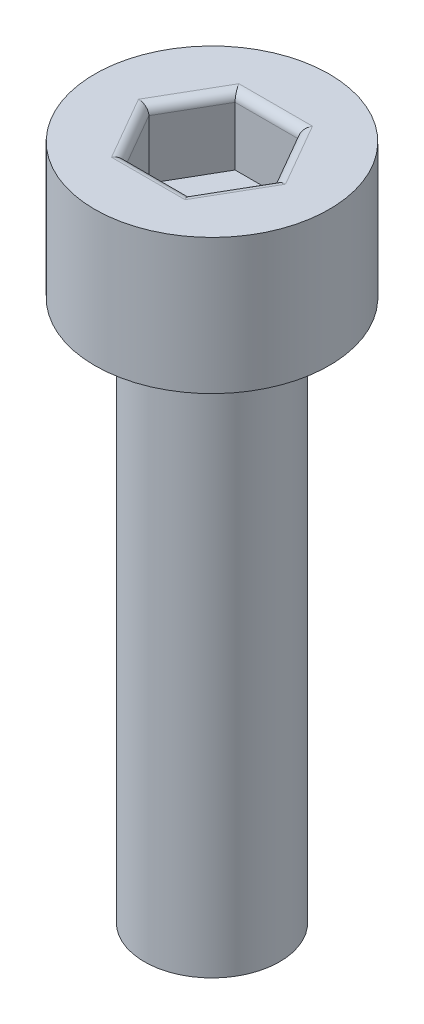
ISO-10303-21;
HEADER;
FILE_DESCRIPTION(('STEP AP214'),'2;1');
FILE_NAME('part.step','',(''),(''),'','','');
FILE_SCHEMA(('AUTOMOTIVE_DESIGN { 1 0 10303 214 1 1 1 1 }'));
ENDSEC;
DATA;
#1=APPLICATION_CONTEXT('core data for automotive mechanical design processes');
#2=APPLICATION_PROTOCOL_DEFINITION('international standard','automotive_design',2000,#1);
#3=PRODUCT_CONTEXT('',#1,'mechanical');
#4=PRODUCT('Part','Part','',(#3));
#5=PRODUCT_RELATED_PRODUCT_CATEGORY('part','',(#4));
#6=PRODUCT_DEFINITION_FORMATION('','',#4);
#7=PRODUCT_DEFINITION_CONTEXT('part definition',#1,'design');
#8=PRODUCT_DEFINITION('design','',#6,#7);
#9=PRODUCT_DEFINITION_SHAPE('','',#8);
#10=(LENGTH_UNIT() NAMED_UNIT(*) SI_UNIT(.MILLI.,.METRE.));
#11=(NAMED_UNIT(*) PLANE_ANGLE_UNIT() SI_UNIT($,.RADIAN.));
#12=(NAMED_UNIT(*) SI_UNIT($,.STERADIAN.) SOLID_ANGLE_UNIT());
#13=UNCERTAINTY_MEASURE_WITH_UNIT(LENGTH_MEASURE(1.E-05),#10,'distance_accuracy_value','');
#14=(GEOMETRIC_REPRESENTATION_CONTEXT(3) GLOBAL_UNCERTAINTY_ASSIGNED_CONTEXT((#13)) GLOBAL_UNIT_ASSIGNED_CONTEXT((#10,
#11,#12)) REPRESENTATION_CONTEXT('',''));
#15=CARTESIAN_POINT('',(0.,0.,0.));
#16=DIRECTION('',(0.,0.,1.));
#17=DIRECTION('',(1.,0.,0.));
#18=AXIS2_PLACEMENT_3D('',#15,#16,#17);
#19=CARTESIAN_POINT('',(0.,3.,0.));
#20=DIRECTION('',(0.,1.,0.));
#21=DIRECTION('',(0.,0.,1.));
#22=AXIS2_PLACEMENT_3D('',#19,#20,#21);
#23=PLANE('',#22);
#24=DIRECTION('',(0.499999999999998,0.,-0.86602540378444));
#25=VECTOR('',#24,1.);
#26=CARTESIAN_POINT('',(-1.22320508075689,3.,-0.706217782649105));
#27=LINE('',#26,#25);
#28=CARTESIAN_POINT('',(-1.63094010767585,3.,0.));
#29=VERTEX_POINT('',#28);
#30=CARTESIAN_POINT('',(-0.81547005383793,3.,-1.41243556529821));
#31=VERTEX_POINT('',#30);
#32=EDGE_CURVE('E159',#29,#31,#27,.T.);
#33=ORIENTED_EDGE('',*,*,#32,.T.);
#34=DIRECTION('',(1.,0.,0.));
#35=VECTOR('',#34,1.);
#36=CARTESIAN_POINT('',(0.,3.,-1.41243556529821));
#37=LINE('',#36,#35);
#38=CARTESIAN_POINT('',(0.81547005383792,3.,-1.41243556529821));
#39=VERTEX_POINT('',#38);
#40=EDGE_CURVE('E161',#31,#39,#37,.T.);
#41=ORIENTED_EDGE('',*,*,#40,.T.);
#42=DIRECTION('',(0.500000000000004,0.,0.866025403784436));
#43=VECTOR('',#42,1.);
#44=CARTESIAN_POINT('',(1.22320508075688,3.,-0.706217782649112));
#45=LINE('',#44,#43);
#46=CARTESIAN_POINT('',(1.63094010767585,3.,0.));
#47=VERTEX_POINT('',#46);
#48=EDGE_CURVE('E155',#39,#47,#45,.T.);
#49=ORIENTED_EDGE('',*,*,#48,.T.);
#50=DIRECTION('',(-0.499999999999998,0.,0.86602540378444));
#51=VECTOR('',#50,1.);
#52=CARTESIAN_POINT('',(1.22320508075689,3.,0.706217782649104));
#53=LINE('',#52,#51);
#54=CARTESIAN_POINT('',(0.815470053837929,3.,1.41243556529821));
#55=VERTEX_POINT('',#54);
#56=EDGE_CURVE('E151',#47,#55,#53,.T.);
#57=ORIENTED_EDGE('',*,*,#56,.T.);
#58=DIRECTION('',(-1.,0.,0.));
#59=VECTOR('',#58,1.);
#60=CARTESIAN_POINT('',(0.,3.,1.41243556529821));
#61=LINE('',#60,#59);
#62=CARTESIAN_POINT('',(-0.815470053837919,3.,1.41243556529821));
#63=VERTEX_POINT('',#62);
#64=EDGE_CURVE('E153',#55,#63,#61,.T.);
#65=ORIENTED_EDGE('',*,*,#64,.T.);
#66=DIRECTION('',(-0.500000000000004,0.,-0.866025403784436));
#67=VECTOR('',#66,1.);
#68=CARTESIAN_POINT('',(-1.22320508075688,3.,0.706217782649113));
#69=LINE('',#68,#67);
#70=EDGE_CURVE('E157',#63,#29,#69,.T.);
#71=ORIENTED_EDGE('',*,*,#70,.T.);
#72=EDGE_LOOP('',(#33,#41,#49,#57,#65,#71));
#73=FACE_BOUND('',#72,.T.);
#74=CARTESIAN_POINT('',(0.,3.,0.));
#75=DIRECTION('',(0.,1.,0.));
#76=DIRECTION('',(0.,0.,1.));
#77=AXIS2_PLACEMENT_3D('',#74,#75,#76);
#78=CIRCLE('',#77,2.6);
#79=CARTESIAN_POINT('',(0.,3.,2.6));
#80=VERTEX_POINT('',#79);
#81=EDGE_CURVE('E142',#80,#80,#78,.T.);
#82=ORIENTED_EDGE('',*,*,#81,.T.);
#83=EDGE_LOOP('',(#82));
#84=FACE_BOUND('',#83,.T.);
#85=ADVANCED_FACE('F41',(#73,#84),#23,.T.);
#86=CARTESIAN_POINT('',(0.,3.,0.));
#87=DIRECTION('',(0.,-1.,0.));
#88=DIRECTION('',(0.,0.,-1.));
#89=AXIS2_PLACEMENT_3D('',#86,#87,#88);
#90=CYLINDRICAL_SURFACE('',#89,2.6);
#91=ORIENTED_EDGE('',*,*,#81,.F.);
#92=EDGE_LOOP('',(#91));
#93=FACE_BOUND('',#92,.T.);
#94=CARTESIAN_POINT('',(0.,0.,0.));
#95=DIRECTION('',(0.,1.,0.));
#96=DIRECTION('',(0.,0.,1.));
#97=AXIS2_PLACEMENT_3D('',#94,#95,#96);
#98=CIRCLE('',#97,2.6);
#99=CARTESIAN_POINT('',(0.,0.,2.6));
#100=VERTEX_POINT('',#99);
#101=EDGE_CURVE('E138',#100,#100,#98,.T.);
#102=ORIENTED_EDGE('',*,*,#101,.T.);
#103=EDGE_LOOP('',(#102));
#104=FACE_BOUND('',#103,.T.);
#105=ADVANCED_FACE('F244',(#93,#104),#90,.T.);
#106=CARTESIAN_POINT('',(0.,0.,0.));
#107=DIRECTION('',(0.,1.,0.));
#108=DIRECTION('',(0.,0.,1.));
#109=AXIS2_PLACEMENT_3D('',#106,#107,#108);
#110=PLANE('',#109);
#111=CARTESIAN_POINT('',(0.,0.,0.));
#112=DIRECTION('',(0.,-1.,0.));
#113=DIRECTION('',(0.,0.,-1.));
#114=AXIS2_PLACEMENT_3D('',#111,#112,#113);
#115=CIRCLE('',#114,1.5);
#116=CARTESIAN_POINT('',(0.,0.,-1.5));
#117=VERTEX_POINT('',#116);
#118=EDGE_CURVE('E149',#117,#117,#115,.T.);
#119=ORIENTED_EDGE('',*,*,#118,.F.);
#120=EDGE_LOOP('',(#119));
#121=FACE_BOUND('',#120,.T.);
#122=ORIENTED_EDGE('',*,*,#101,.F.);
#123=EDGE_LOOP('',(#122));
#124=FACE_BOUND('',#123,.T.);
#125=ADVANCED_FACE('F249',(#121,#124),#110,.F.);
#126=CARTESIAN_POINT('',(-0.699999999999994,1.5,1.21243556529821));
#127=DIRECTION('',(0.866025403784436,0.,-0.500000000000004));
#128=DIRECTION('',(-0.500000000000004,0.,-0.866025403784436));
#129=AXIS2_PLACEMENT_3D('',#126,#127,#128);
#130=PLANE('',#129);
#131=DIRECTION('',(0.,1.,0.));
#132=VECTOR('',#131,1.);
#133=CARTESIAN_POINT('',(-1.4,1.5,0.));
#134=LINE('',#133,#132);
#135=CARTESIAN_POINT('',(-1.4,1.5,0.));
#136=VERTEX_POINT('',#135);
#137=CARTESIAN_POINT('',(-1.4,2.8,0.));
#138=VERTEX_POINT('',#137);
#139=EDGE_CURVE('E130',#136,#138,#134,.T.);
#140=ORIENTED_EDGE('',*,*,#139,.T.);
#141=DIRECTION('',(-0.500000000000004,0.,-0.866025403784436));
#142=VECTOR('',#141,1.);
#143=CARTESIAN_POINT('',(-0.699999999999994,2.8,1.21243556529821));
#144=LINE('',#143,#142);
#145=CARTESIAN_POINT('',(-0.699999999999994,2.8,1.21243556529821));
#146=VERTEX_POINT('',#145);
#147=EDGE_CURVE('E168',#138,#146,#144,.F.);
#148=ORIENTED_EDGE('',*,*,#147,.T.);
#149=DIRECTION('',(0.,1.,0.));
#150=VECTOR('',#149,1.);
#151=CARTESIAN_POINT('',(-0.699999999999994,1.5,1.21243556529821));
#152=LINE('',#151,#150);
#153=CARTESIAN_POINT('',(-0.699999999999994,1.5,1.21243556529821));
#154=VERTEX_POINT('',#153);
#155=EDGE_CURVE('E132',#154,#146,#152,.T.);
#156=ORIENTED_EDGE('',*,*,#155,.F.);
#157=DIRECTION('',(-0.500000000000004,0.,-0.866025403784436));
#158=VECTOR('',#157,1.);
#159=CARTESIAN_POINT('',(-0.699999999999994,1.5,1.21243556529821));
#160=LINE('',#159,#158);
#161=EDGE_CURVE('E118',#154,#136,#160,.T.);
#162=ORIENTED_EDGE('',*,*,#161,.T.);
#163=EDGE_LOOP('',(#140,#148,#156,#162));
#164=FACE_BOUND('',#163,.T.);
#165=ADVANCED_FACE('F129',(#164),#130,.T.);
#166=CARTESIAN_POINT('',(-1.4,1.5,0.));
#167=DIRECTION('',(0.86602540378444,0.,0.499999999999998));
#168=DIRECTION('',(0.499999999999998,0.,-0.86602540378444));
#169=AXIS2_PLACEMENT_3D('',#166,#167,#168);
#170=PLANE('',#169);
#171=DIRECTION('',(0.,1.,0.));
#172=VECTOR('',#171,1.);
#173=CARTESIAN_POINT('',(-0.700000000000004,1.5,-1.21243556529821));
#174=LINE('',#173,#172);
#175=CARTESIAN_POINT('',(-0.700000000000004,1.5,-1.21243556529821));
#176=VERTEX_POINT('',#175);
#177=CARTESIAN_POINT('',(-0.700000000000004,2.8,-1.21243556529821));
#178=VERTEX_POINT('',#177);
#179=EDGE_CURVE('E139',#176,#178,#174,.T.);
#180=ORIENTED_EDGE('',*,*,#179,.T.);
#181=DIRECTION('',(0.499999999999998,0.,-0.86602540378444));
#182=VECTOR('',#181,1.);
#183=CARTESIAN_POINT('',(-1.4,2.8,0.));
#184=LINE('',#183,#182);
#185=EDGE_CURVE('E137',#178,#138,#184,.F.);
#186=ORIENTED_EDGE('',*,*,#185,.T.);
#187=ORIENTED_EDGE('',*,*,#139,.F.);
#188=DIRECTION('',(0.499999999999998,0.,-0.86602540378444));
#189=VECTOR('',#188,1.);
#190=CARTESIAN_POINT('',(-1.4,1.5,0.));
#191=LINE('',#190,#189);
#192=EDGE_CURVE('E114',#136,#176,#191,.T.);
#193=ORIENTED_EDGE('',*,*,#192,.T.);
#194=EDGE_LOOP('',(#180,#186,#187,#193));
#195=FACE_BOUND('',#194,.T.);
#196=ADVANCED_FACE('F135',(#195),#170,.T.);
#197=CARTESIAN_POINT('',(-0.700000000000004,1.5,-1.21243556529821));
#198=DIRECTION('',(0.,0.,1.));
#199=DIRECTION('',(1.,0.,0.));
#200=AXIS2_PLACEMENT_3D('',#197,#198,#199);
#201=PLANE('',#200);
#202=DIRECTION('',(0.,1.,0.));
#203=VECTOR('',#202,1.);
#204=CARTESIAN_POINT('',(0.699999999999995,1.5,-1.21243556529821));
#205=LINE('',#204,#203);
#206=CARTESIAN_POINT('',(0.699999999999995,1.5,-1.21243556529821));
#207=VERTEX_POINT('',#206);
#208=CARTESIAN_POINT('',(0.699999999999995,2.8,-1.21243556529821));
#209=VERTEX_POINT('',#208);
#210=EDGE_CURVE('E144',#207,#209,#205,.T.);
#211=ORIENTED_EDGE('',*,*,#210,.T.);
#212=DIRECTION('',(1.,0.,0.));
#213=VECTOR('',#212,1.);
#214=CARTESIAN_POINT('',(-0.700000000000004,2.8,-1.21243556529821));
#215=LINE('',#214,#213);
#216=EDGE_CURVE('E164',#209,#178,#215,.F.);
#217=ORIENTED_EDGE('',*,*,#216,.T.);
#218=ORIENTED_EDGE('',*,*,#179,.F.);
#219=DIRECTION('',(1.,0.,0.));
#220=VECTOR('',#219,1.);
#221=CARTESIAN_POINT('',(-0.700000000000004,1.5,-1.21243556529821));
#222=LINE('',#221,#220);
#223=EDGE_CURVE('E120',#176,#207,#222,.T.);
#224=ORIENTED_EDGE('',*,*,#223,.T.);
#225=EDGE_LOOP('',(#211,#217,#218,#224));
#226=FACE_BOUND('',#225,.T.);
#227=ADVANCED_FACE('F213',(#226),#201,.T.);
#228=CARTESIAN_POINT('',(0.699999999999995,1.5,-1.21243556529821));
#229=DIRECTION('',(-0.866025403784436,0.,0.500000000000004));
#230=DIRECTION('',(0.500000000000004,0.,0.866025403784436));
#231=AXIS2_PLACEMENT_3D('',#228,#229,#230);
#232=PLANE('',#231);
#233=DIRECTION('',(0.,1.,0.));
#234=VECTOR('',#233,1.);
#235=CARTESIAN_POINT('',(1.4,1.5,0.));
#236=LINE('',#235,#234);
#237=CARTESIAN_POINT('',(1.4,1.5,0.));
#238=VERTEX_POINT('',#237);
#239=CARTESIAN_POINT('',(1.4,2.8,0.));
#240=VERTEX_POINT('',#239);
#241=EDGE_CURVE('E208',#238,#240,#236,.T.);
#242=ORIENTED_EDGE('',*,*,#241,.T.);
#243=DIRECTION('',(0.500000000000004,0.,0.866025403784436));
#244=VECTOR('',#243,1.);
#245=CARTESIAN_POINT('',(0.699999999999995,2.8,-1.21243556529821));
#246=LINE('',#245,#244);
#247=EDGE_CURVE('E170',#240,#209,#246,.F.);
#248=ORIENTED_EDGE('',*,*,#247,.T.);
#249=ORIENTED_EDGE('',*,*,#210,.F.);
#250=DIRECTION('',(0.500000000000004,0.,0.866025403784436));
#251=VECTOR('',#250,1.);
#252=CARTESIAN_POINT('',(0.699999999999995,1.5,-1.21243556529821));
#253=LINE('',#252,#251);
#254=EDGE_CURVE('E199',#207,#238,#253,.T.);
#255=ORIENTED_EDGE('',*,*,#254,.T.);
#256=EDGE_LOOP('',(#242,#248,#249,#255));
#257=FACE_BOUND('',#256,.T.);
#258=ADVANCED_FACE('F355',(#257),#232,.T.);
#259=CARTESIAN_POINT('',(1.4,1.5,0.));
#260=DIRECTION('',(-0.86602540378444,0.,-0.499999999999998));
#261=DIRECTION('',(-0.499999999999998,0.,0.86602540378444));
#262=AXIS2_PLACEMENT_3D('',#259,#260,#261);
#263=PLANE('',#262);
#264=DIRECTION('',(0.,1.,0.));
#265=VECTOR('',#264,1.);
#266=CARTESIAN_POINT('',(0.700000000000004,1.5,1.21243556529821));
#267=LINE('',#266,#265);
#268=CARTESIAN_POINT('',(0.700000000000004,1.5,1.21243556529821));
#269=VERTEX_POINT('',#268);
#270=CARTESIAN_POINT('',(0.700000000000004,2.8,1.21243556529821));
#271=VERTEX_POINT('',#270);
#272=EDGE_CURVE('E206',#269,#271,#267,.T.);
#273=ORIENTED_EDGE('',*,*,#272,.T.);
#274=DIRECTION('',(-0.499999999999998,0.,0.86602540378444));
#275=VECTOR('',#274,1.);
#276=CARTESIAN_POINT('',(1.4,2.8,0.));
#277=LINE('',#276,#275);
#278=EDGE_CURVE('E11',#271,#240,#277,.F.);
#279=ORIENTED_EDGE('',*,*,#278,.T.);
#280=ORIENTED_EDGE('',*,*,#241,.F.);
#281=DIRECTION('',(-0.499999999999998,0.,0.86602540378444));
#282=VECTOR('',#281,1.);
#283=CARTESIAN_POINT('',(1.4,1.5,0.));
#284=LINE('',#283,#282);
#285=EDGE_CURVE('E201',#238,#269,#284,.T.);
#286=ORIENTED_EDGE('',*,*,#285,.T.);
#287=EDGE_LOOP('',(#273,#279,#280,#286));
#288=FACE_BOUND('',#287,.T.);
#289=ADVANCED_FACE('F345',(#288),#263,.T.);
#290=CARTESIAN_POINT('',(0.700000000000004,1.5,1.21243556529821));
#291=DIRECTION('',(0.,0.,-1.));
#292=DIRECTION('',(-1.,0.,0.));
#293=AXIS2_PLACEMENT_3D('',#290,#291,#292);
#294=PLANE('',#293);
#295=ORIENTED_EDGE('',*,*,#155,.T.);
#296=DIRECTION('',(-1.,0.,0.));
#297=VECTOR('',#296,1.);
#298=CARTESIAN_POINT('',(0.700000000000004,2.8,1.21243556529821));
#299=LINE('',#298,#297);
#300=EDGE_CURVE('E50',#146,#271,#299,.F.);
#301=ORIENTED_EDGE('',*,*,#300,.T.);
#302=ORIENTED_EDGE('',*,*,#272,.F.);
#303=DIRECTION('',(-1.,0.,0.));
#304=VECTOR('',#303,1.);
#305=CARTESIAN_POINT('',(0.700000000000004,1.5,1.21243556529821));
#306=LINE('',#305,#304);
#307=EDGE_CURVE('E203',#269,#154,#306,.T.);
#308=ORIENTED_EDGE('',*,*,#307,.T.);
#309=EDGE_LOOP('',(#295,#301,#302,#308));
#310=FACE_BOUND('',#309,.T.);
#311=ADVANCED_FACE('F232',(#310),#294,.T.);
#312=CARTESIAN_POINT('',(0.,1.5,0.));
#313=DIRECTION('',(0.,-1.,0.));
#314=DIRECTION('',(0.,0.,-1.));
#315=AXIS2_PLACEMENT_3D('',#312,#313,#314);
#316=PLANE('',#315);
#317=ORIENTED_EDGE('',*,*,#161,.F.);
#318=ORIENTED_EDGE('',*,*,#307,.F.);
#319=ORIENTED_EDGE('',*,*,#285,.F.);
#320=ORIENTED_EDGE('',*,*,#254,.F.);
#321=ORIENTED_EDGE('',*,*,#223,.F.);
#322=ORIENTED_EDGE('',*,*,#192,.F.);
#323=EDGE_LOOP('',(#317,#318,#319,#320,#321,#322));
#324=FACE_BOUND('',#323,.T.);
#325=ADVANCED_FACE('F116',(#324),#316,.F.);
#326=CARTESIAN_POINT('',(0.,-12.,0.));
#327=DIRECTION('',(0.,1.,0.));
#328=DIRECTION('',(0.,0.,1.));
#329=AXIS2_PLACEMENT_3D('',#326,#327,#328);
#330=CYLINDRICAL_SURFACE('',#329,1.5);
#331=CARTESIAN_POINT('',(0.,-12.,0.));
#332=DIRECTION('',(0.,-1.,0.));
#333=DIRECTION('',(0.,0.,-1.));
#334=AXIS2_PLACEMENT_3D('',#331,#332,#333);
#335=CIRCLE('',#334,1.5);
#336=CARTESIAN_POINT('',(0.,-12.,-1.5));
#337=VERTEX_POINT('',#336);
#338=EDGE_CURVE('E133',#337,#337,#335,.T.);
#339=ORIENTED_EDGE('',*,*,#338,.F.);
#340=EDGE_LOOP('',(#339));
#341=FACE_BOUND('',#340,.T.);
#342=ORIENTED_EDGE('',*,*,#118,.T.);
#343=EDGE_LOOP('',(#342));
#344=FACE_BOUND('',#343,.T.);
#345=ADVANCED_FACE('F315',(#341,#344),#330,.T.);
#346=CARTESIAN_POINT('',(0.,-12.,0.));
#347=DIRECTION('',(0.,-1.,0.));
#348=DIRECTION('',(0.,0.,-1.));
#349=AXIS2_PLACEMENT_3D('',#346,#347,#348);
#350=PLANE('',#349);
#351=ORIENTED_EDGE('',*,*,#338,.T.);
#352=EDGE_LOOP('',(#351));
#353=FACE_BOUND('',#352,.T.);
#354=ADVANCED_FACE('F305',(#353),#350,.T.);
#355=CARTESIAN_POINT('',(0.,2.8,1.41243556529821));
#356=DIRECTION('',(-1.,0.,0.));
#357=DIRECTION('',(0.,0.,1.));
#358=AXIS2_PLACEMENT_3D('',#355,#356,#357);
#359=CYLINDRICAL_SURFACE('',#358,0.2);
#360=CARTESIAN_POINT('',(0.815470053837929,2.8,1.41243556529821));
#361=DIRECTION('',(-0.866025403784438,0.,0.500000000000001));
#362=DIRECTION('',(-0.500000000000001,0.,-0.866025403784438));
#363=AXIS2_PLACEMENT_3D('',#360,#361,#362);
#364=ELLIPSE('',#363,0.23094010767585,0.2);
#365=EDGE_CURVE('E182',#271,#55,#364,.F.);
#366=ORIENTED_EDGE('',*,*,#365,.F.);
#367=ORIENTED_EDGE('',*,*,#300,.F.);
#368=CARTESIAN_POINT('',(-0.815470053837919,2.8,1.41243556529821));
#369=DIRECTION('',(-0.86602540378444,0.,-0.499999999999998));
#370=DIRECTION('',(0.499999999999998,0.,-0.86602540378444));
#371=AXIS2_PLACEMENT_3D('',#368,#369,#370);
#372=ELLIPSE('',#371,0.23094010767585,0.2);
#373=EDGE_CURVE('E45',#63,#146,#372,.T.);
#374=ORIENTED_EDGE('',*,*,#373,.F.);
#375=ORIENTED_EDGE('',*,*,#64,.F.);
#376=EDGE_LOOP('',(#366,#367,#374,#375));
#377=FACE_BOUND('',#376,.T.);
#378=ADVANCED_FACE('F43',(#377),#359,.T.);
#379=CARTESIAN_POINT('',(-1.22320508075688,2.8,0.706217782649112));
#380=DIRECTION('',(-0.500000000000004,0.,-0.866025403784436));
#381=DIRECTION('',(-0.866025403784436,0.,0.500000000000004));
#382=AXIS2_PLACEMENT_3D('',#379,#380,#381);
#383=CYLINDRICAL_SURFACE('',#382,0.2);
#384=ORIENTED_EDGE('',*,*,#373,.T.);
#385=ORIENTED_EDGE('',*,*,#147,.F.);
#386=CARTESIAN_POINT('',(-1.63094010767585,2.8,0.));
#387=DIRECTION('',(0.,0.,-1.));
#388=DIRECTION('',(1.,0.,0.));
#389=AXIS2_PLACEMENT_3D('',#386,#387,#388);
#390=ELLIPSE('',#389,0.23094010767585,0.2);
#391=EDGE_CURVE('E180',#29,#138,#390,.T.);
#392=ORIENTED_EDGE('',*,*,#391,.F.);
#393=ORIENTED_EDGE('',*,*,#70,.F.);
#394=EDGE_LOOP('',(#384,#385,#392,#393));
#395=FACE_BOUND('',#394,.T.);
#396=ADVANCED_FACE('F231',(#395),#383,.T.);
#397=CARTESIAN_POINT('',(1.22320508075689,2.8,0.706217782649104));
#398=DIRECTION('',(-0.499999999999998,0.,0.86602540378444));
#399=DIRECTION('',(0.86602540378444,0.,0.499999999999998));
#400=AXIS2_PLACEMENT_3D('',#397,#398,#399);
#401=CYLINDRICAL_SURFACE('',#400,0.2);
#402=ORIENTED_EDGE('',*,*,#365,.T.);
#403=ORIENTED_EDGE('',*,*,#56,.F.);
#404=CARTESIAN_POINT('',(1.63094010767585,2.8,0.));
#405=DIRECTION('',(0.,0.,1.));
#406=DIRECTION('',(1.,0.,0.));
#407=AXIS2_PLACEMENT_3D('',#404,#405,#406);
#408=ELLIPSE('',#407,0.23094010767585,0.2);
#409=EDGE_CURVE('E177',#240,#47,#408,.F.);
#410=ORIENTED_EDGE('',*,*,#409,.F.);
#411=ORIENTED_EDGE('',*,*,#278,.F.);
#412=EDGE_LOOP('',(#402,#403,#410,#411));
#413=FACE_BOUND('',#412,.T.);
#414=ADVANCED_FACE('F235',(#413),#401,.T.);
#415=CARTESIAN_POINT('',(-1.22320508075689,2.8,-0.706217782649105));
#416=DIRECTION('',(0.499999999999998,0.,-0.86602540378444));
#417=DIRECTION('',(-0.86602540378444,0.,-0.499999999999998));
#418=AXIS2_PLACEMENT_3D('',#415,#416,#417);
#419=CYLINDRICAL_SURFACE('',#418,0.2);
#420=ORIENTED_EDGE('',*,*,#391,.T.);
#421=ORIENTED_EDGE('',*,*,#185,.F.);
#422=CARTESIAN_POINT('',(-0.815470053837929,2.8,-1.41243556529821));
#423=DIRECTION('',(0.866025403784438,0.,-0.500000000000001));
#424=DIRECTION('',(0.500000000000001,0.,0.866025403784438));
#425=AXIS2_PLACEMENT_3D('',#422,#423,#424);
#426=ELLIPSE('',#425,0.23094010767585,0.2);
#427=EDGE_CURVE('E175',#31,#178,#426,.T.);
#428=ORIENTED_EDGE('',*,*,#427,.F.);
#429=ORIENTED_EDGE('',*,*,#32,.F.);
#430=EDGE_LOOP('',(#420,#421,#428,#429));
#431=FACE_BOUND('',#430,.T.);
#432=ADVANCED_FACE('F230',(#431),#419,.T.);
#433=CARTESIAN_POINT('',(1.22320508075688,2.8,-0.706217782649112));
#434=DIRECTION('',(0.500000000000004,0.,0.866025403784436));
#435=DIRECTION('',(0.866025403784436,0.,-0.500000000000004));
#436=AXIS2_PLACEMENT_3D('',#433,#434,#435);
#437=CYLINDRICAL_SURFACE('',#436,0.2);
#438=ORIENTED_EDGE('',*,*,#409,.T.);
#439=ORIENTED_EDGE('',*,*,#48,.F.);
#440=CARTESIAN_POINT('',(0.815470053837919,2.8,-1.41243556529821));
#441=DIRECTION('',(0.86602540378444,0.,0.499999999999998));
#442=DIRECTION('',(0.499999999999998,0.,-0.86602540378444));
#443=AXIS2_PLACEMENT_3D('',#440,#441,#442);
#444=ELLIPSE('',#443,0.23094010767585,0.2);
#445=EDGE_CURVE('E173',#209,#39,#444,.F.);
#446=ORIENTED_EDGE('',*,*,#445,.F.);
#447=ORIENTED_EDGE('',*,*,#247,.F.);
#448=EDGE_LOOP('',(#438,#439,#446,#447));
#449=FACE_BOUND('',#448,.T.);
#450=ADVANCED_FACE('F223',(#449),#437,.T.);
#451=CARTESIAN_POINT('',(0.,2.8,-1.41243556529821));
#452=DIRECTION('',(1.,0.,0.));
#453=DIRECTION('',(0.,0.,-1.));
#454=AXIS2_PLACEMENT_3D('',#451,#452,#453);
#455=CYLINDRICAL_SURFACE('',#454,0.2);
#456=ORIENTED_EDGE('',*,*,#427,.T.);
#457=ORIENTED_EDGE('',*,*,#216,.F.);
#458=ORIENTED_EDGE('',*,*,#445,.T.);
#459=ORIENTED_EDGE('',*,*,#40,.F.);
#460=EDGE_LOOP('',(#456,#457,#458,#459));
#461=FACE_BOUND('',#460,.T.);
#462=ADVANCED_FACE('F217',(#461),#455,.T.);
#463=CLOSED_SHELL('',(#85,#105,#125,#165,#196,#227,#258,#289,#311,#325,#345,#354,#378,#396,#414,
#432,#450,#462));
#464=MANIFOLD_SOLID_BREP('B2',#463);
#465=ADVANCED_BREP_SHAPE_REPRESENTATION('',(#18,#464),#14);
#466=SHAPE_DEFINITION_REPRESENTATION(#9,#465);
ENDSEC;
END-ISO-10303-21;
